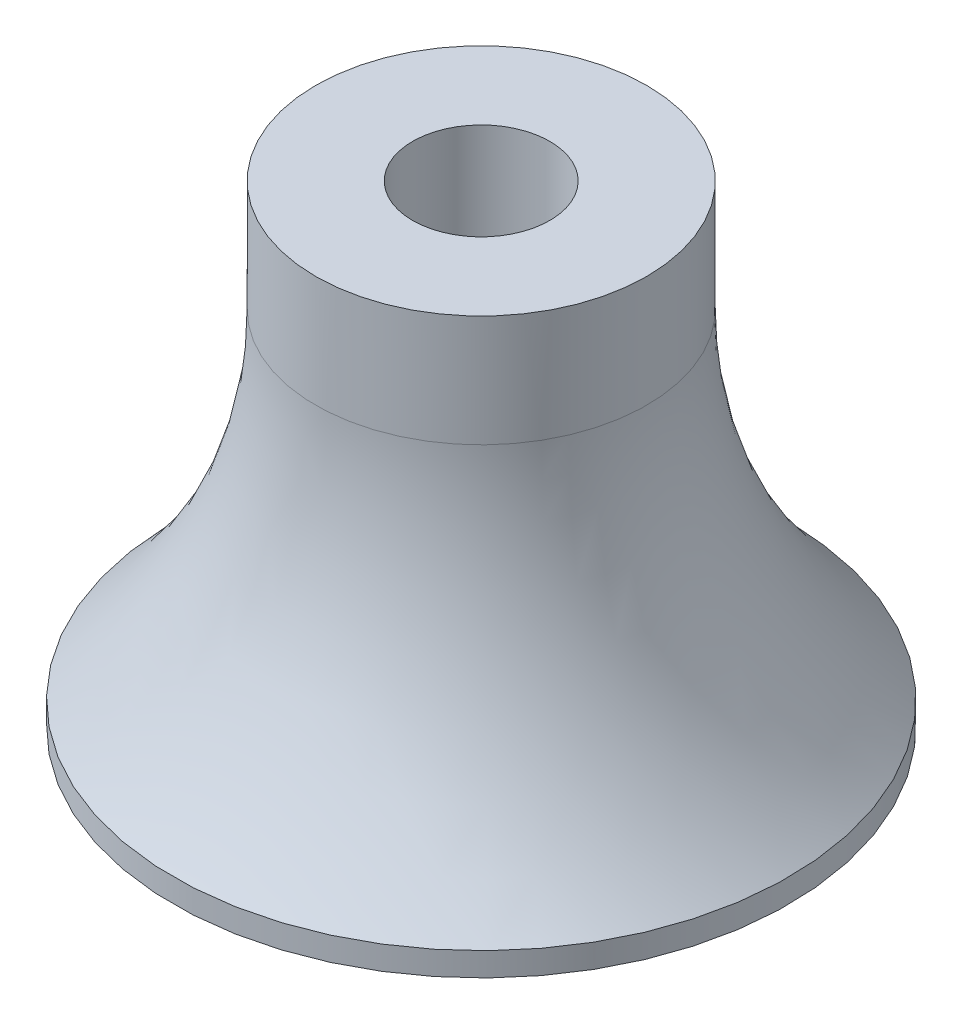
ISO-10303-21;
HEADER;
FILE_DESCRIPTION(('STEP AP214'),'2;1');
FILE_NAME('part.step','',(''),(''),'','','');
FILE_SCHEMA(('AUTOMOTIVE_DESIGN { 1 0 10303 214 1 1 1 1 }'));
ENDSEC;
DATA;
#1=APPLICATION_CONTEXT('core data for automotive mechanical design processes');
#2=APPLICATION_PROTOCOL_DEFINITION('international standard','automotive_design',2000,#1);
#3=PRODUCT_CONTEXT('',#1,'mechanical');
#4=PRODUCT('Part','Part','',(#3));
#5=PRODUCT_RELATED_PRODUCT_CATEGORY('part','',(#4));
#6=PRODUCT_DEFINITION_FORMATION('','',#4);
#7=PRODUCT_DEFINITION_CONTEXT('part definition',#1,'design');
#8=PRODUCT_DEFINITION('design','',#6,#7);
#9=PRODUCT_DEFINITION_SHAPE('','',#8);
#10=(LENGTH_UNIT() NAMED_UNIT(*) SI_UNIT(.MILLI.,.METRE.));
#11=(NAMED_UNIT(*) PLANE_ANGLE_UNIT() SI_UNIT($,.RADIAN.));
#12=(NAMED_UNIT(*) SI_UNIT($,.STERADIAN.) SOLID_ANGLE_UNIT());
#13=UNCERTAINTY_MEASURE_WITH_UNIT(LENGTH_MEASURE(1.E-05),#10,'distance_accuracy_value','');
#14=(GEOMETRIC_REPRESENTATION_CONTEXT(3) GLOBAL_UNCERTAINTY_ASSIGNED_CONTEXT((#13)) GLOBAL_UNIT_ASSIGNED_CONTEXT((#10,
#11,#12)) REPRESENTATION_CONTEXT('',''));
#15=CARTESIAN_POINT('',(0.,0.,0.));
#16=DIRECTION('',(0.,0.,1.));
#17=DIRECTION('',(1.,0.,0.));
#18=AXIS2_PLACEMENT_3D('',#15,#16,#17);
#19=CARTESIAN_POINT('',(0.,10.,0.));
#20=DIRECTION('',(0.,-1.,0.));
#21=DIRECTION('',(0.,0.,-1.));
#22=AXIS2_PLACEMENT_3D('',#19,#20,#21);
#23=CYLINDRICAL_SURFACE('',#22,3.5);
#24=CARTESIAN_POINT('',(0.,7.64142842854285,0.));
#25=DIRECTION('',(0.,-1.,0.));
#26=DIRECTION('',(0.,0.,-1.));
#27=AXIS2_PLACEMENT_3D('',#24,#25,#26);
#28=CIRCLE('',#27,3.5);
#29=CARTESIAN_POINT('',(0.,7.64142842854285,-3.5));
#30=VERTEX_POINT('',#29);
#31=EDGE_CURVE('E10',#30,#30,#28,.F.);
#32=ORIENTED_EDGE('',*,*,#31,.T.);
#33=EDGE_LOOP('',(#32));
#34=FACE_BOUND('',#33,.T.);
#35=CARTESIAN_POINT('',(0.,10.,0.));
#36=DIRECTION('',(0.,1.,0.));
#37=DIRECTION('',(0.,0.,1.));
#38=AXIS2_PLACEMENT_3D('',#35,#36,#37);
#39=CIRCLE('',#38,3.5);
#40=CARTESIAN_POINT('',(0.,10.,3.5));
#41=VERTEX_POINT('',#40);
#42=EDGE_CURVE('E47',#41,#41,#39,.T.);
#43=ORIENTED_EDGE('',*,*,#42,.F.);
#44=EDGE_LOOP('',(#43));
#45=FACE_BOUND('',#44,.T.);
#46=ADVANCED_FACE('F39',(#34,#45),#23,.T.);
#47=CARTESIAN_POINT('',(0.,10.,0.));
#48=DIRECTION('',(0.,1.,0.));
#49=DIRECTION('',(0.,0.,1.));
#50=AXIS2_PLACEMENT_3D('',#47,#48,#49);
#51=PLANE('',#50);
#52=ORIENTED_EDGE('',*,*,#42,.T.);
#53=EDGE_LOOP('',(#52));
#54=FACE_BOUND('',#53,.T.);
#55=CARTESIAN_POINT('',(0.,10.,0.));
#56=DIRECTION('',(0.,1.,0.));
#57=DIRECTION('',(0.,0.,1.));
#58=AXIS2_PLACEMENT_3D('',#55,#56,#57);
#59=CIRCLE('',#58,1.45);
#60=CARTESIAN_POINT('',(0.,10.,1.45));
#61=VERTEX_POINT('',#60);
#62=EDGE_CURVE('E52',#61,#61,#59,.T.);
#63=ORIENTED_EDGE('',*,*,#62,.F.);
#64=EDGE_LOOP('',(#63));
#65=FACE_BOUND('',#64,.T.);
#66=ADVANCED_FACE('F83',(#54,#65),#51,.T.);
#67=CARTESIAN_POINT('',(0.,0.,0.));
#68=DIRECTION('',(0.,1.,0.));
#69=DIRECTION('',(0.,0.,1.));
#70=AXIS2_PLACEMENT_3D('',#67,#68,#69);
#71=PLANE('',#70);
#72=CARTESIAN_POINT('',(0.,0.,0.));
#73=DIRECTION('',(0.,1.,0.));
#74=DIRECTION('',(0.,0.,1.));
#75=AXIS2_PLACEMENT_3D('',#72,#73,#74);
#76=CIRCLE('',#75,1.45);
#77=CARTESIAN_POINT('',(0.,0.,1.45));
#78=VERTEX_POINT('',#77);
#79=EDGE_CURVE('E57',#78,#78,#76,.T.);
#80=ORIENTED_EDGE('',*,*,#79,.T.);
#81=EDGE_LOOP('',(#80));
#82=FACE_BOUND('',#81,.T.);
#83=CARTESIAN_POINT('',(0.,0.,0.));
#84=DIRECTION('',(0.,-1.,0.));
#85=DIRECTION('',(0.,0.,-1.));
#86=AXIS2_PLACEMENT_3D('',#83,#84,#85);
#87=CIRCLE('',#86,6.5);
#88=CARTESIAN_POINT('',(0.,0.,-6.5));
#89=VERTEX_POINT('',#88);
#90=EDGE_CURVE('E64',#89,#89,#87,.T.);
#91=ORIENTED_EDGE('',*,*,#90,.T.);
#92=EDGE_LOOP('',(#91));
#93=FACE_BOUND('',#92,.T.);
#94=ADVANCED_FACE('F87',(#82,#93),#71,.F.);
#95=CARTESIAN_POINT('',(0.,10.,0.));
#96=DIRECTION('',(0.,-1.,0.));
#97=DIRECTION('',(0.,0.,-1.));
#98=AXIS2_PLACEMENT_3D('',#95,#96,#97);
#99=CYLINDRICAL_SURFACE('',#98,1.45);
#100=ORIENTED_EDGE('',*,*,#79,.F.);
#101=EDGE_LOOP('',(#100));
#102=FACE_BOUND('',#101,.T.);
#103=ORIENTED_EDGE('',*,*,#62,.T.);
#104=EDGE_LOOP('',(#103));
#105=FACE_BOUND('',#104,.T.);
#106=ADVANCED_FACE('F80',(#102,#105),#99,.F.);
#107=CARTESIAN_POINT('',(0.,0.5,0.));
#108=DIRECTION('',(0.,-1.,0.));
#109=DIRECTION('',(0.,0.,-1.));
#110=AXIS2_PLACEMENT_3D('',#107,#108,#109);
#111=CYLINDRICAL_SURFACE('',#110,6.5);
#112=CARTESIAN_POINT('',(0.,0.5,0.));
#113=DIRECTION('',(0.,-1.,0.));
#114=DIRECTION('',(0.,0.,-1.));
#115=AXIS2_PLACEMENT_3D('',#112,#113,#114);
#116=CIRCLE('',#115,6.5);
#117=CARTESIAN_POINT('',(0.,0.5,-6.5));
#118=VERTEX_POINT('',#117);
#119=EDGE_CURVE('E62',#118,#118,#116,.T.);
#120=ORIENTED_EDGE('',*,*,#119,.T.);
#121=EDGE_LOOP('',(#120));
#122=FACE_BOUND('',#121,.T.);
#123=ORIENTED_EDGE('',*,*,#90,.F.);
#124=EDGE_LOOP('',(#123));
#125=FACE_BOUND('',#124,.T.);
#126=ADVANCED_FACE('F72',(#122,#125),#111,.T.);
#127=CARTESIAN_POINT('',(0.,7.64142842854285,0.));
#128=DIRECTION('',(0.,-1.,0.));
#129=DIRECTION('',(0.,0.,-1.));
#130=AXIS2_PLACEMENT_3D('',#127,#128,#129);
#131=TOROIDAL_SURFACE('',#130,13.5,10.);
#132=ORIENTED_EDGE('',*,*,#31,.F.);
#133=EDGE_LOOP('',(#132));
#134=FACE_BOUND('',#133,.T.);
#135=ORIENTED_EDGE('',*,*,#119,.F.);
#136=EDGE_LOOP('',(#135));
#137=FACE_BOUND('',#136,.T.);
#138=ADVANCED_FACE('F41',(#134,#137),#131,.F.);
#139=CLOSED_SHELL('',(#46,#66,#94,#106,#126,#138));
#140=MANIFOLD_SOLID_BREP('B2',#139);
#141=ADVANCED_BREP_SHAPE_REPRESENTATION('',(#18,#140),#14);
#142=SHAPE_DEFINITION_REPRESENTATION(#9,#141);
ENDSEC;
END-ISO-10303-21;
